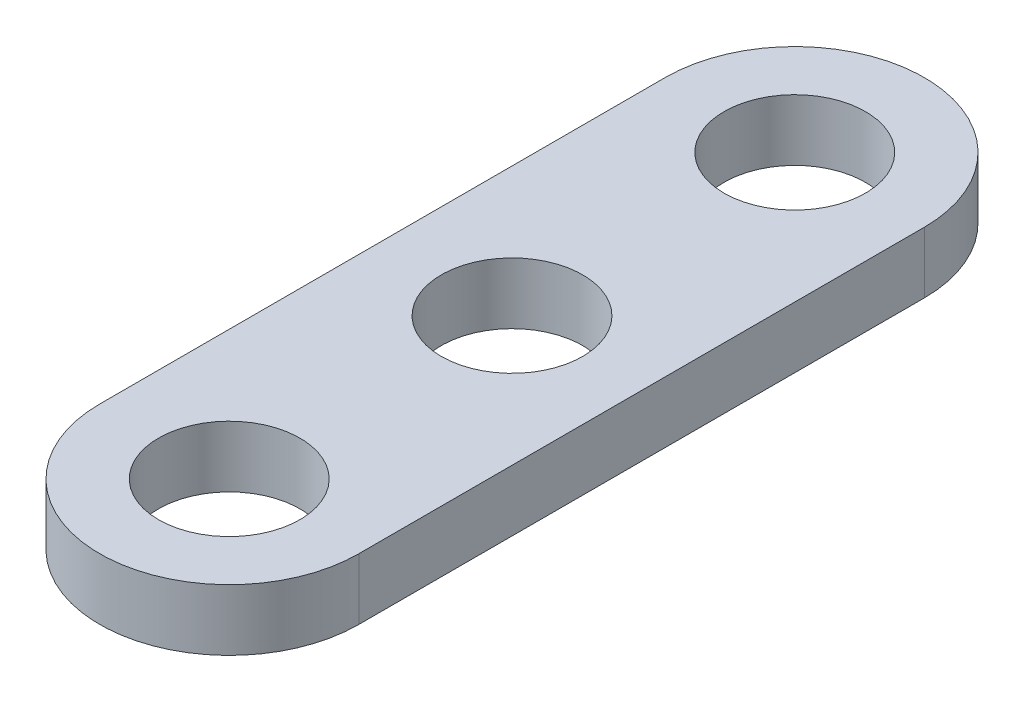
ISO-10303-21;
HEADER;
FILE_DESCRIPTION(('STEP AP214'),'2;1');
FILE_NAME('part.step','',(''),(''),'','','');
FILE_SCHEMA(('AUTOMOTIVE_DESIGN { 1 0 10303 214 1 1 1 1 }'));
ENDSEC;
DATA;
#1=APPLICATION_CONTEXT('core data for automotive mechanical design processes');
#2=APPLICATION_PROTOCOL_DEFINITION('international standard','automotive_design',2000,#1);
#3=PRODUCT_CONTEXT('',#1,'mechanical');
#4=PRODUCT('Part','Part','',(#3));
#5=PRODUCT_RELATED_PRODUCT_CATEGORY('part','',(#4));
#6=PRODUCT_DEFINITION_FORMATION('','',#4);
#7=PRODUCT_DEFINITION_CONTEXT('part definition',#1,'design');
#8=PRODUCT_DEFINITION('design','',#6,#7);
#9=PRODUCT_DEFINITION_SHAPE('','',#8);
#10=(LENGTH_UNIT() NAMED_UNIT(*) SI_UNIT(.MILLI.,.METRE.));
#11=(NAMED_UNIT(*) PLANE_ANGLE_UNIT() SI_UNIT($,.RADIAN.));
#12=(NAMED_UNIT(*) SI_UNIT($,.STERADIAN.) SOLID_ANGLE_UNIT());
#13=UNCERTAINTY_MEASURE_WITH_UNIT(LENGTH_MEASURE(1.E-05),#10,'distance_accuracy_value','');
#14=(GEOMETRIC_REPRESENTATION_CONTEXT(3) GLOBAL_UNCERTAINTY_ASSIGNED_CONTEXT((#13)) GLOBAL_UNIT_ASSIGNED_CONTEXT((#10,
#11,#12)) REPRESENTATION_CONTEXT('',''));
#15=CARTESIAN_POINT('',(0.,0.,0.));
#16=DIRECTION('',(0.,0.,1.));
#17=DIRECTION('',(1.,0.,0.));
#18=AXIS2_PLACEMENT_3D('',#15,#16,#17);
#19=CARTESIAN_POINT('',(0.,2.6,-6.08774538645467));
#20=DIRECTION('',(0.,1.,0.));
#21=DIRECTION('',(0.,0.,1.));
#22=AXIS2_PLACEMENT_3D('',#19,#20,#21);
#23=PLANE('',#22);
#24=CARTESIAN_POINT('',(0.,2.6,17.9122546135453));
#25=DIRECTION('',(0.,1.,0.));
#26=DIRECTION('',(0.,0.,1.));
#27=AXIS2_PLACEMENT_3D('',#24,#25,#26);
#28=CIRCLE('',#27,3.);
#29=CARTESIAN_POINT('',(0.,2.6,20.9122546135453));
#30=VERTEX_POINT('',#29);
#31=EDGE_CURVE('E123',#30,#30,#28,.T.);
#32=ORIENTED_EDGE('',*,*,#31,.F.);
#33=EDGE_LOOP('',(#32));
#34=FACE_BOUND('',#33,.T.);
#35=CARTESIAN_POINT('',(0.,2.6,-6.08774538645467));
#36=DIRECTION('',(0.,1.,0.));
#37=DIRECTION('',(0.,0.,1.));
#38=AXIS2_PLACEMENT_3D('',#35,#36,#37);
#39=CIRCLE('',#38,5.5);
#40=CARTESIAN_POINT('',(5.5,2.6,-6.08774538645467));
#41=VERTEX_POINT('',#40);
#42=CARTESIAN_POINT('',(-5.5,2.6,-6.08774538645467));
#43=VERTEX_POINT('',#42);
#44=EDGE_CURVE('E91',#41,#43,#39,.T.);
#45=ORIENTED_EDGE('',*,*,#44,.T.);
#46=DIRECTION('',(0.,0.,1.));
#47=VECTOR('',#46,1.);
#48=CARTESIAN_POINT('',(-5.5,2.6,-6.08774538645467));
#49=LINE('',#48,#47);
#50=CARTESIAN_POINT('',(-5.5,2.6,17.9122546135453));
#51=VERTEX_POINT('',#50);
#52=EDGE_CURVE('E86',#43,#51,#49,.T.);
#53=ORIENTED_EDGE('',*,*,#52,.T.);
#54=CARTESIAN_POINT('',(0.,2.6,17.9122546135453));
#55=DIRECTION('',(0.,1.,0.));
#56=DIRECTION('',(0.,0.,1.));
#57=AXIS2_PLACEMENT_3D('',#54,#55,#56);
#58=CIRCLE('',#57,5.5);
#59=CARTESIAN_POINT('',(5.5,2.6,17.9122546135453));
#60=VERTEX_POINT('',#59);
#61=EDGE_CURVE('E87',#51,#60,#58,.T.);
#62=ORIENTED_EDGE('',*,*,#61,.T.);
#63=DIRECTION('',(0.,0.,-1.));
#64=VECTOR('',#63,1.);
#65=CARTESIAN_POINT('',(5.5,2.6,-6.08774538645467));
#66=LINE('',#65,#64);
#67=EDGE_CURVE('E57',#60,#41,#66,.T.);
#68=ORIENTED_EDGE('',*,*,#67,.T.);
#69=EDGE_LOOP('',(#45,#53,#62,#68));
#70=FACE_BOUND('',#69,.T.);
#71=CARTESIAN_POINT('',(0.,2.6,-6.08774538645467));
#72=DIRECTION('',(0.,1.,0.));
#73=DIRECTION('',(0.,0.,1.));
#74=AXIS2_PLACEMENT_3D('',#71,#72,#73);
#75=CIRCLE('',#74,3.);
#76=CARTESIAN_POINT('',(0.,2.6,-3.08774538645467));
#77=VERTEX_POINT('',#76);
#78=EDGE_CURVE('E106',#77,#77,#75,.T.);
#79=ORIENTED_EDGE('',*,*,#78,.F.);
#80=EDGE_LOOP('',(#79));
#81=FACE_BOUND('',#80,.T.);
#82=CARTESIAN_POINT('',(0.,2.6,5.91225461354533));
#83=DIRECTION('',(0.,1.,0.));
#84=DIRECTION('',(0.,0.,1.));
#85=AXIS2_PLACEMENT_3D('',#82,#83,#84);
#86=CIRCLE('',#85,3.);
#87=CARTESIAN_POINT('',(0.,2.6,8.91225461354533));
#88=VERTEX_POINT('',#87);
#89=EDGE_CURVE('E130',#88,#88,#86,.T.);
#90=ORIENTED_EDGE('',*,*,#89,.F.);
#91=EDGE_LOOP('',(#90));
#92=FACE_BOUND('',#91,.T.);
#93=ADVANCED_FACE('F39',(#34,#70,#81,#92),#23,.T.);
#94=CARTESIAN_POINT('',(0.,0.,-6.08774538645467));
#95=DIRECTION('',(0.,1.,0.));
#96=DIRECTION('',(0.,0.,1.));
#97=AXIS2_PLACEMENT_3D('',#94,#95,#96);
#98=PLANE('',#97);
#99=CARTESIAN_POINT('',(0.,0.,-6.08774538645467));
#100=DIRECTION('',(0.,1.,0.));
#101=DIRECTION('',(0.,0.,1.));
#102=AXIS2_PLACEMENT_3D('',#99,#100,#101);
#103=CIRCLE('',#102,5.5);
#104=CARTESIAN_POINT('',(5.5,0.,-6.08774538645467));
#105=VERTEX_POINT('',#104);
#106=CARTESIAN_POINT('',(-5.5,0.,-6.08774538645467));
#107=VERTEX_POINT('',#106);
#108=EDGE_CURVE('E104',#105,#107,#103,.T.);
#109=ORIENTED_EDGE('',*,*,#108,.F.);
#110=DIRECTION('',(0.,0.,-1.));
#111=VECTOR('',#110,1.);
#112=CARTESIAN_POINT('',(5.5,0.,-6.08774538645467));
#113=LINE('',#112,#111);
#114=CARTESIAN_POINT('',(5.5,0.,17.9122546135453));
#115=VERTEX_POINT('',#114);
#116=EDGE_CURVE('E80',#115,#105,#113,.T.);
#117=ORIENTED_EDGE('',*,*,#116,.F.);
#118=CARTESIAN_POINT('',(0.,0.,17.9122546135453));
#119=DIRECTION('',(0.,1.,0.));
#120=DIRECTION('',(0.,0.,1.));
#121=AXIS2_PLACEMENT_3D('',#118,#119,#120);
#122=CIRCLE('',#121,5.5);
#123=CARTESIAN_POINT('',(-5.5,0.,17.9122546135453));
#124=VERTEX_POINT('',#123);
#125=EDGE_CURVE('E74',#124,#115,#122,.T.);
#126=ORIENTED_EDGE('',*,*,#125,.F.);
#127=DIRECTION('',(0.,0.,1.));
#128=VECTOR('',#127,1.);
#129=CARTESIAN_POINT('',(-5.5,0.,-6.08774538645467));
#130=LINE('',#129,#128);
#131=EDGE_CURVE('E94',#107,#124,#130,.T.);
#132=ORIENTED_EDGE('',*,*,#131,.F.);
#133=EDGE_LOOP('',(#109,#117,#126,#132));
#134=FACE_BOUND('',#133,.T.);
#135=CARTESIAN_POINT('',(0.,0.,-6.08774538645467));
#136=DIRECTION('',(0.,1.,0.));
#137=DIRECTION('',(0.,0.,1.));
#138=AXIS2_PLACEMENT_3D('',#135,#136,#137);
#139=CIRCLE('',#138,3.);
#140=CARTESIAN_POINT('',(0.,0.,-3.08774538645467));
#141=VERTEX_POINT('',#140);
#142=EDGE_CURVE('E119',#141,#141,#139,.T.);
#143=ORIENTED_EDGE('',*,*,#142,.T.);
#144=EDGE_LOOP('',(#143));
#145=FACE_BOUND('',#144,.T.);
#146=CARTESIAN_POINT('',(0.,0.,17.9122546135453));
#147=DIRECTION('',(0.,1.,0.));
#148=DIRECTION('',(0.,0.,1.));
#149=AXIS2_PLACEMENT_3D('',#146,#147,#148);
#150=CIRCLE('',#149,3.);
#151=CARTESIAN_POINT('',(0.,0.,20.9122546135453));
#152=VERTEX_POINT('',#151);
#153=EDGE_CURVE('E125',#152,#152,#150,.T.);
#154=ORIENTED_EDGE('',*,*,#153,.T.);
#155=EDGE_LOOP('',(#154));
#156=FACE_BOUND('',#155,.T.);
#157=CARTESIAN_POINT('',(0.,0.,5.91225461354533));
#158=DIRECTION('',(0.,1.,0.));
#159=DIRECTION('',(0.,0.,1.));
#160=AXIS2_PLACEMENT_3D('',#157,#158,#159);
#161=CIRCLE('',#160,3.);
#162=CARTESIAN_POINT('',(0.,0.,8.91225461354533));
#163=VERTEX_POINT('',#162);
#164=EDGE_CURVE('E127',#163,#163,#161,.T.);
#165=ORIENTED_EDGE('',*,*,#164,.T.);
#166=EDGE_LOOP('',(#165));
#167=FACE_BOUND('',#166,.T.);
#168=ADVANCED_FACE('F114',(#134,#145,#156,#167),#98,.F.);
#169=CARTESIAN_POINT('',(0.,2.6,-6.08774538645467));
#170=DIRECTION('',(0.,-1.,0.));
#171=DIRECTION('',(0.,0.,-1.));
#172=AXIS2_PLACEMENT_3D('',#169,#170,#171);
#173=CYLINDRICAL_SURFACE('',#172,5.5);
#174=ORIENTED_EDGE('',*,*,#108,.T.);
#175=DIRECTION('',(0.,-1.,0.));
#176=VECTOR('',#175,1.);
#177=CARTESIAN_POINT('',(-5.5,2.6,-6.08774538645467));
#178=LINE('',#177,#176);
#179=EDGE_CURVE('E11',#43,#107,#178,.T.);
#180=ORIENTED_EDGE('',*,*,#179,.F.);
#181=ORIENTED_EDGE('',*,*,#44,.F.);
#182=DIRECTION('',(0.,-1.,0.));
#183=VECTOR('',#182,1.);
#184=CARTESIAN_POINT('',(5.5,2.6,-6.08774538645467));
#185=LINE('',#184,#183);
#186=EDGE_CURVE('E98',#41,#105,#185,.T.);
#187=ORIENTED_EDGE('',*,*,#186,.T.);
#188=EDGE_LOOP('',(#174,#180,#181,#187));
#189=FACE_BOUND('',#188,.T.);
#190=ADVANCED_FACE('F41',(#189),#173,.T.);
#191=CARTESIAN_POINT('',(-5.5,2.6,-6.08774538645467));
#192=DIRECTION('',(1.,0.,0.));
#193=DIRECTION('',(0.,0.,-1.));
#194=AXIS2_PLACEMENT_3D('',#191,#192,#193);
#195=PLANE('',#194);
#196=ORIENTED_EDGE('',*,*,#131,.T.);
#197=DIRECTION('',(0.,-1.,0.));
#198=VECTOR('',#197,1.);
#199=CARTESIAN_POINT('',(-5.5,2.6,17.9122546135453));
#200=LINE('',#199,#198);
#201=EDGE_CURVE('E48',#51,#124,#200,.T.);
#202=ORIENTED_EDGE('',*,*,#201,.F.);
#203=ORIENTED_EDGE('',*,*,#52,.F.);
#204=ORIENTED_EDGE('',*,*,#179,.T.);
#205=EDGE_LOOP('',(#196,#202,#203,#204));
#206=FACE_BOUND('',#205,.T.);
#207=ADVANCED_FACE('F92',(#206),#195,.F.);
#208=CARTESIAN_POINT('',(0.,2.6,17.9122546135453));
#209=DIRECTION('',(0.,-1.,0.));
#210=DIRECTION('',(0.,0.,-1.));
#211=AXIS2_PLACEMENT_3D('',#208,#209,#210);
#212=CYLINDRICAL_SURFACE('',#211,5.5);
#213=ORIENTED_EDGE('',*,*,#125,.T.);
#214=DIRECTION('',(0.,-1.,0.));
#215=VECTOR('',#214,1.);
#216=CARTESIAN_POINT('',(5.5,2.6,17.9122546135453));
#217=LINE('',#216,#215);
#218=EDGE_CURVE('E96',#60,#115,#217,.T.);
#219=ORIENTED_EDGE('',*,*,#218,.F.);
#220=ORIENTED_EDGE('',*,*,#61,.F.);
#221=ORIENTED_EDGE('',*,*,#201,.T.);
#222=EDGE_LOOP('',(#213,#219,#220,#221));
#223=FACE_BOUND('',#222,.T.);
#224=ADVANCED_FACE('F100',(#223),#212,.T.);
#225=CARTESIAN_POINT('',(5.5,2.6,-6.08774538645467));
#226=DIRECTION('',(-1.,0.,0.));
#227=DIRECTION('',(0.,0.,1.));
#228=AXIS2_PLACEMENT_3D('',#225,#226,#227);
#229=PLANE('',#228);
#230=ORIENTED_EDGE('',*,*,#116,.T.);
#231=ORIENTED_EDGE('',*,*,#186,.F.);
#232=ORIENTED_EDGE('',*,*,#67,.F.);
#233=ORIENTED_EDGE('',*,*,#218,.T.);
#234=EDGE_LOOP('',(#230,#231,#232,#233));
#235=FACE_BOUND('',#234,.T.);
#236=ADVANCED_FACE('F112',(#235),#229,.F.);
#237=CARTESIAN_POINT('',(0.,2.6,-6.08774538645467));
#238=DIRECTION('',(0.,-1.,0.));
#239=DIRECTION('',(0.,0.,-1.));
#240=AXIS2_PLACEMENT_3D('',#237,#238,#239);
#241=CYLINDRICAL_SURFACE('',#240,3.);
#242=ORIENTED_EDGE('',*,*,#78,.T.);
#243=EDGE_LOOP('',(#242));
#244=FACE_BOUND('',#243,.T.);
#245=ORIENTED_EDGE('',*,*,#142,.F.);
#246=EDGE_LOOP('',(#245));
#247=FACE_BOUND('',#246,.T.);
#248=ADVANCED_FACE('F149',(#244,#247),#241,.F.);
#249=CARTESIAN_POINT('',(0.,2.6,17.9122546135453));
#250=DIRECTION('',(0.,-1.,0.));
#251=DIRECTION('',(0.,0.,-1.));
#252=AXIS2_PLACEMENT_3D('',#249,#250,#251);
#253=CYLINDRICAL_SURFACE('',#252,3.);
#254=ORIENTED_EDGE('',*,*,#31,.T.);
#255=EDGE_LOOP('',(#254));
#256=FACE_BOUND('',#255,.T.);
#257=ORIENTED_EDGE('',*,*,#153,.F.);
#258=EDGE_LOOP('',(#257));
#259=FACE_BOUND('',#258,.T.);
#260=ADVANCED_FACE('F194',(#256,#259),#253,.F.);
#261=CARTESIAN_POINT('',(0.,2.6,5.91225461354533));
#262=DIRECTION('',(0.,-1.,0.));
#263=DIRECTION('',(0.,0.,-1.));
#264=AXIS2_PLACEMENT_3D('',#261,#262,#263);
#265=CYLINDRICAL_SURFACE('',#264,3.);
#266=ORIENTED_EDGE('',*,*,#89,.T.);
#267=EDGE_LOOP('',(#266));
#268=FACE_BOUND('',#267,.T.);
#269=ORIENTED_EDGE('',*,*,#164,.F.);
#270=EDGE_LOOP('',(#269));
#271=FACE_BOUND('',#270,.T.);
#272=ADVANCED_FACE('F136',(#268,#271),#265,.F.);
#273=CLOSED_SHELL('',(#93,#168,#190,#207,#224,#236,#248,#260,#272));
#274=MANIFOLD_SOLID_BREP('B2',#273);
#275=ADVANCED_BREP_SHAPE_REPRESENTATION('',(#18,#274),#14);
#276=SHAPE_DEFINITION_REPRESENTATION(#9,#275);
ENDSEC;
END-ISO-10303-21;
